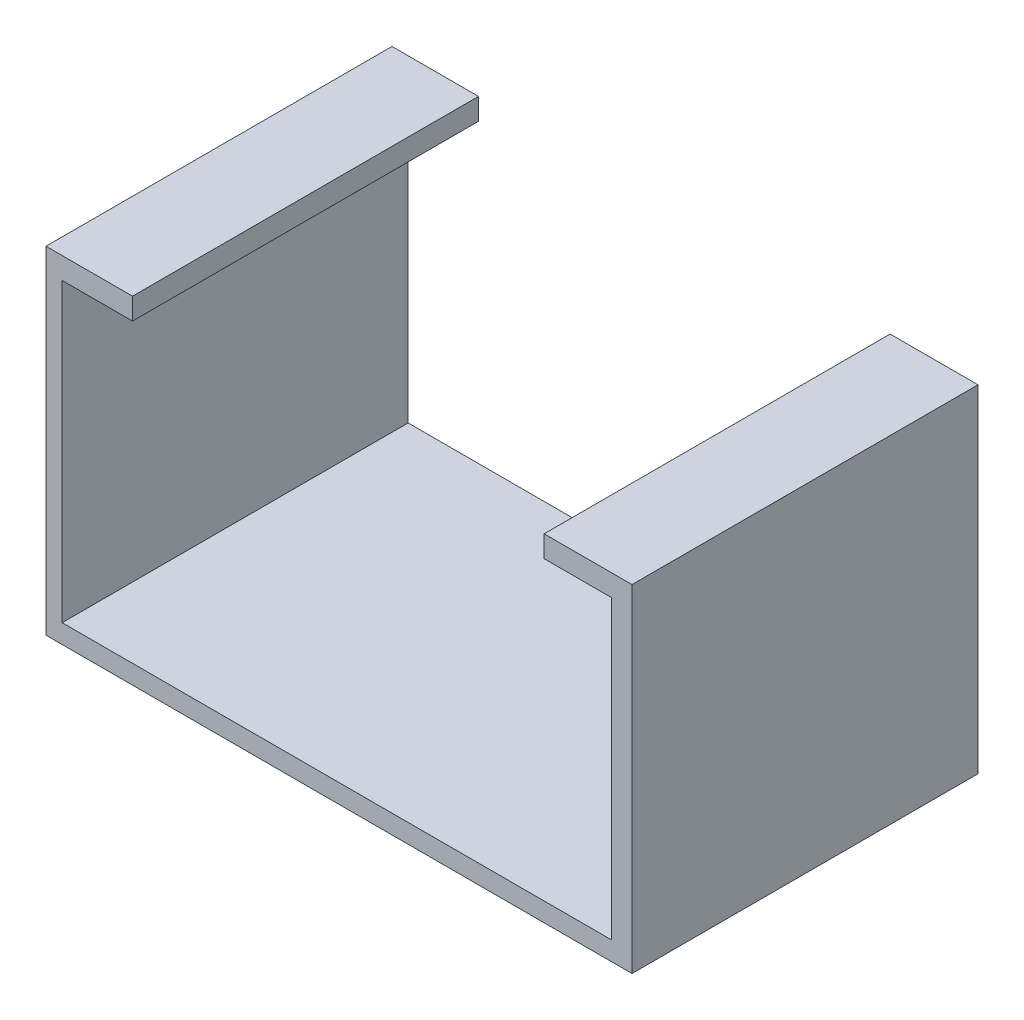
ISO-10303-21;
HEADER;
FILE_DESCRIPTION(('STEP AP214'),'2;1');
FILE_NAME('part.step','',(''),(''),'','','');
FILE_SCHEMA(('AUTOMOTIVE_DESIGN { 1 0 10303 214 1 1 1 1 }'));
ENDSEC;
DATA;
#1=APPLICATION_CONTEXT('core data for automotive mechanical design processes');
#2=APPLICATION_PROTOCOL_DEFINITION('international standard','automotive_design',2000,#1);
#3=PRODUCT_CONTEXT('',#1,'mechanical');
#4=PRODUCT('Part','Part','',(#3));
#5=PRODUCT_RELATED_PRODUCT_CATEGORY('part','',(#4));
#6=PRODUCT_DEFINITION_FORMATION('','',#4);
#7=PRODUCT_DEFINITION_CONTEXT('part definition',#1,'design');
#8=PRODUCT_DEFINITION('design','',#6,#7);
#9=PRODUCT_DEFINITION_SHAPE('','',#8);
#10=(LENGTH_UNIT() NAMED_UNIT(*) SI_UNIT(.MILLI.,.METRE.));
#11=(NAMED_UNIT(*) PLANE_ANGLE_UNIT() SI_UNIT($,.RADIAN.));
#12=(NAMED_UNIT(*) SI_UNIT($,.STERADIAN.) SOLID_ANGLE_UNIT());
#13=UNCERTAINTY_MEASURE_WITH_UNIT(LENGTH_MEASURE(1.E-05),#10,'distance_accuracy_value','');
#14=(GEOMETRIC_REPRESENTATION_CONTEXT(3) GLOBAL_UNCERTAINTY_ASSIGNED_CONTEXT((#13)) GLOBAL_UNIT_ASSIGNED_CONTEXT((#10,
#11,#12)) REPRESENTATION_CONTEXT('',''));
#15=CARTESIAN_POINT('',(0.,0.,0.));
#16=DIRECTION('',(0.,0.,1.));
#17=DIRECTION('',(1.,0.,0.));
#18=AXIS2_PLACEMENT_3D('',#15,#16,#17);
#19=CARTESIAN_POINT('',(-5.08115062,-2.921,6.0000007));
#20=DIRECTION('',(0.,0.,1.));
#21=DIRECTION('',(1.,0.,0.));
#22=AXIS2_PLACEMENT_3D('',#19,#20,#21);
#23=PLANE('',#22);
#24=DIRECTION('',(-1.,0.,0.));
#25=VECTOR('',#24,1.);
#26=CARTESIAN_POINT('',(5.08115062,-2.921,6.0000007));
#27=LINE('',#26,#25);
#28=CARTESIAN_POINT('',(5.08115062,-2.921,6.0000007));
#29=VERTEX_POINT('',#28);
#30=CARTESIAN_POINT('',(-5.08115062,-2.921,6.0000007));
#31=VERTEX_POINT('',#30);
#32=EDGE_CURVE('E27',#29,#31,#27,.T.);
#33=ORIENTED_EDGE('',*,*,#32,.F.);
#34=DIRECTION('',(0.,-1.,0.));
#35=VECTOR('',#34,1.);
#36=CARTESIAN_POINT('',(5.08115062,2.921,6.0000007));
#37=LINE('',#36,#35);
#38=CARTESIAN_POINT('',(5.08115062,2.921,6.0000007));
#39=VERTEX_POINT('',#38);
#40=EDGE_CURVE('E204',#39,#29,#37,.T.);
#41=ORIENTED_EDGE('',*,*,#40,.F.);
#42=DIRECTION('',(1.,0.,0.));
#43=VECTOR('',#42,1.);
#44=CARTESIAN_POINT('',(3.55715062,2.921,6.0000007));
#45=LINE('',#44,#43);
#46=CARTESIAN_POINT('',(3.55715062,2.921,6.0000007));
#47=VERTEX_POINT('',#46);
#48=EDGE_CURVE('E198',#47,#39,#45,.T.);
#49=ORIENTED_EDGE('',*,*,#48,.F.);
#50=DIRECTION('',(0.,1.,0.));
#51=VECTOR('',#50,1.);
#52=CARTESIAN_POINT('',(3.55715062,2.54700024,6.0000007));
#53=LINE('',#52,#51);
#54=CARTESIAN_POINT('',(3.55715062,2.54700024,6.0000007));
#55=VERTEX_POINT('',#54);
#56=EDGE_CURVE('E230',#55,#47,#53,.T.);
#57=ORIENTED_EDGE('',*,*,#56,.F.);
#58=DIRECTION('',(-1.,0.,0.));
#59=VECTOR('',#58,1.);
#60=CARTESIAN_POINT('',(4.72115134,2.54700024,6.0000007));
#61=LINE('',#60,#59);
#62=CARTESIAN_POINT('',(4.72115134,2.54700024,6.0000007));
#63=VERTEX_POINT('',#62);
#64=EDGE_CURVE('E177',#63,#55,#61,.T.);
#65=ORIENTED_EDGE('',*,*,#64,.F.);
#66=DIRECTION('',(0.,1.,0.));
#67=VECTOR('',#66,1.);
#68=CARTESIAN_POINT('',(4.72115134,-2.59299964,6.0000007));
#69=LINE('',#68,#67);
#70=CARTESIAN_POINT('',(4.72115134,-2.59299964,6.0000007));
#71=VERTEX_POINT('',#70);
#72=EDGE_CURVE('E186',#71,#63,#69,.T.);
#73=ORIENTED_EDGE('',*,*,#72,.F.);
#74=DIRECTION('',(1.,0.,0.));
#75=VECTOR('',#74,1.);
#76=CARTESIAN_POINT('',(-4.80115118,-2.59299964,6.0000007));
#77=LINE('',#76,#75);
#78=CARTESIAN_POINT('',(-4.80115118,-2.59299964,6.0000007));
#79=VERTEX_POINT('',#78);
#80=EDGE_CURVE('E170',#79,#71,#77,.T.);
#81=ORIENTED_EDGE('',*,*,#80,.F.);
#82=DIRECTION('',(0.,-1.,0.));
#83=VECTOR('',#82,1.);
#84=CARTESIAN_POINT('',(-4.80115118,2.54700024,6.0000007));
#85=LINE('',#84,#83);
#86=CARTESIAN_POINT('',(-4.80115118,2.54700024,6.0000007));
#87=VERTEX_POINT('',#86);
#88=EDGE_CURVE('E192',#87,#79,#85,.T.);
#89=ORIENTED_EDGE('',*,*,#88,.F.);
#90=DIRECTION('',(-1.,0.,0.));
#91=VECTOR('',#90,1.);
#92=CARTESIAN_POINT('',(-3.58115108,2.54700024,6.0000007));
#93=LINE('',#92,#91);
#94=CARTESIAN_POINT('',(-3.58115108,2.54700024,6.0000007));
#95=VERTEX_POINT('',#94);
#96=EDGE_CURVE('E141',#95,#87,#93,.T.);
#97=ORIENTED_EDGE('',*,*,#96,.F.);
#98=DIRECTION('',(0.,-1.,0.));
#99=VECTOR('',#98,1.);
#100=CARTESIAN_POINT('',(-3.58115108,2.921,6.0000007));
#101=LINE('',#100,#99);
#102=CARTESIAN_POINT('',(-3.58115108,2.921,6.0000007));
#103=VERTEX_POINT('',#102);
#104=EDGE_CURVE('E152',#103,#95,#101,.T.);
#105=ORIENTED_EDGE('',*,*,#104,.F.);
#106=DIRECTION('',(1.,0.,0.));
#107=VECTOR('',#106,1.);
#108=CARTESIAN_POINT('',(-5.08115062,2.921,6.0000007));
#109=LINE('',#108,#107);
#110=CARTESIAN_POINT('',(-5.08115062,2.921,6.0000007));
#111=VERTEX_POINT('',#110);
#112=EDGE_CURVE('E155',#111,#103,#109,.T.);
#113=ORIENTED_EDGE('',*,*,#112,.F.);
#114=DIRECTION('',(0.,1.,0.));
#115=VECTOR('',#114,1.);
#116=CARTESIAN_POINT('',(-5.08115062,-2.921,6.0000007));
#117=LINE('',#116,#115);
#118=EDGE_CURVE('E203',#31,#111,#117,.T.);
#119=ORIENTED_EDGE('',*,*,#118,.F.);
#120=EDGE_LOOP('',(#33,#41,#49,#57,#65,#73,#81,#89,#97,#105,#113,#119));
#121=FACE_BOUND('',#120,.T.);
#122=ADVANCED_FACE('F16',(#121),#23,.T.);
#123=CARTESIAN_POINT('',(-5.08115062,-2.921,0.));
#124=DIRECTION('',(0.,0.,1.));
#125=DIRECTION('',(1.,0.,0.));
#126=AXIS2_PLACEMENT_3D('',#123,#124,#125);
#127=PLANE('',#126);
#128=DIRECTION('',(0.,1.,0.));
#129=VECTOR('',#128,1.);
#130=CARTESIAN_POINT('',(-5.08115062,-2.921,0.));
#131=LINE('',#130,#129);
#132=CARTESIAN_POINT('',(-5.08115062,-2.921,0.));
#133=VERTEX_POINT('',#132);
#134=CARTESIAN_POINT('',(-5.08115062,2.921,0.));
#135=VERTEX_POINT('',#134);
#136=EDGE_CURVE('E147',#133,#135,#131,.T.);
#137=ORIENTED_EDGE('',*,*,#136,.T.);
#138=DIRECTION('',(1.,0.,0.));
#139=VECTOR('',#138,1.);
#140=CARTESIAN_POINT('',(-5.08115062,2.921,0.));
#141=LINE('',#140,#139);
#142=CARTESIAN_POINT('',(-3.58115108,2.921,0.));
#143=VERTEX_POINT('',#142);
#144=EDGE_CURVE('E144',#135,#143,#141,.T.);
#145=ORIENTED_EDGE('',*,*,#144,.T.);
#146=DIRECTION('',(0.,-1.,0.));
#147=VECTOR('',#146,1.);
#148=CARTESIAN_POINT('',(-3.58115108,2.921,0.));
#149=LINE('',#148,#147);
#150=CARTESIAN_POINT('',(-3.58115108,2.54700024,0.));
#151=VERTEX_POINT('',#150);
#152=EDGE_CURVE('E129',#143,#151,#149,.T.);
#153=ORIENTED_EDGE('',*,*,#152,.T.);
#154=DIRECTION('',(-1.,0.,0.));
#155=VECTOR('',#154,1.);
#156=CARTESIAN_POINT('',(-3.58115108,2.54700024,0.));
#157=LINE('',#156,#155);
#158=CARTESIAN_POINT('',(-4.80115118,2.54700024,0.));
#159=VERTEX_POINT('',#158);
#160=EDGE_CURVE('E213',#151,#159,#157,.T.);
#161=ORIENTED_EDGE('',*,*,#160,.T.);
#162=DIRECTION('',(0.,-1.,0.));
#163=VECTOR('',#162,1.);
#164=CARTESIAN_POINT('',(-4.80115118,2.54700024,0.));
#165=LINE('',#164,#163);
#166=CARTESIAN_POINT('',(-4.80115118,-2.59299964,0.));
#167=VERTEX_POINT('',#166);
#168=EDGE_CURVE('E166',#159,#167,#165,.T.);
#169=ORIENTED_EDGE('',*,*,#168,.T.);
#170=DIRECTION('',(1.,0.,0.));
#171=VECTOR('',#170,1.);
#172=CARTESIAN_POINT('',(-4.80115118,-2.59299964,0.));
#173=LINE('',#172,#171);
#174=CARTESIAN_POINT('',(4.72115134,-2.59299964,0.));
#175=VERTEX_POINT('',#174);
#176=EDGE_CURVE('E234',#167,#175,#173,.T.);
#177=ORIENTED_EDGE('',*,*,#176,.T.);
#178=DIRECTION('',(0.,1.,0.));
#179=VECTOR('',#178,1.);
#180=CARTESIAN_POINT('',(4.72115134,-2.59299964,0.));
#181=LINE('',#180,#179);
#182=CARTESIAN_POINT('',(4.72115134,2.54700024,0.));
#183=VERTEX_POINT('',#182);
#184=EDGE_CURVE('E185',#175,#183,#181,.T.);
#185=ORIENTED_EDGE('',*,*,#184,.T.);
#186=DIRECTION('',(-1.,0.,0.));
#187=VECTOR('',#186,1.);
#188=CARTESIAN_POINT('',(4.72115134,2.54700024,0.));
#189=LINE('',#188,#187);
#190=CARTESIAN_POINT('',(3.55715062,2.54700024,0.));
#191=VERTEX_POINT('',#190);
#192=EDGE_CURVE('E176',#183,#191,#189,.T.);
#193=ORIENTED_EDGE('',*,*,#192,.T.);
#194=DIRECTION('',(0.,1.,0.));
#195=VECTOR('',#194,1.);
#196=CARTESIAN_POINT('',(3.55715062,2.54700024,0.));
#197=LINE('',#196,#195);
#198=CARTESIAN_POINT('',(3.55715062,2.921,0.));
#199=VERTEX_POINT('',#198);
#200=EDGE_CURVE('E214',#191,#199,#197,.T.);
#201=ORIENTED_EDGE('',*,*,#200,.T.);
#202=DIRECTION('',(1.,0.,0.));
#203=VECTOR('',#202,1.);
#204=CARTESIAN_POINT('',(3.55715062,2.921,0.));
#205=LINE('',#204,#203);
#206=CARTESIAN_POINT('',(5.08115062,2.921,0.));
#207=VERTEX_POINT('',#206);
#208=EDGE_CURVE('E197',#199,#207,#205,.T.);
#209=ORIENTED_EDGE('',*,*,#208,.T.);
#210=DIRECTION('',(0.,-1.,0.));
#211=VECTOR('',#210,1.);
#212=CARTESIAN_POINT('',(5.08115062,2.921,0.));
#213=LINE('',#212,#211);
#214=CARTESIAN_POINT('',(5.08115062,-2.921,0.));
#215=VERTEX_POINT('',#214);
#216=EDGE_CURVE('E226',#207,#215,#213,.T.);
#217=ORIENTED_EDGE('',*,*,#216,.T.);
#218=DIRECTION('',(-1.,0.,0.));
#219=VECTOR('',#218,1.);
#220=CARTESIAN_POINT('',(5.08115062,-2.921,0.));
#221=LINE('',#220,#219);
#222=EDGE_CURVE('E11',#215,#133,#221,.T.);
#223=ORIENTED_EDGE('',*,*,#222,.T.);
#224=EDGE_LOOP('',(#137,#145,#153,#161,#169,#177,#185,#193,#201,#209,#217,#223));
#225=FACE_BOUND('',#224,.T.);
#226=ADVANCED_FACE('F145',(#225),#127,.F.);
#227=CARTESIAN_POINT('',(5.08115062,-2.921,0.));
#228=DIRECTION('',(0.,-1.,0.));
#229=DIRECTION('',(0.,0.,-1.));
#230=AXIS2_PLACEMENT_3D('',#227,#228,#229);
#231=PLANE('',#230);
#232=DIRECTION('',(0.,0.,1.));
#233=VECTOR('',#232,1.);
#234=CARTESIAN_POINT('',(5.08115062,-2.921,0.));
#235=LINE('',#234,#233);
#236=EDGE_CURVE('E208',#215,#29,#235,.T.);
#237=ORIENTED_EDGE('',*,*,#236,.T.);
#238=ORIENTED_EDGE('',*,*,#32,.T.);
#239=DIRECTION('',(0.,0.,1.));
#240=VECTOR('',#239,1.);
#241=CARTESIAN_POINT('',(-5.08115062,-2.921,0.));
#242=LINE('',#241,#240);
#243=EDGE_CURVE('E199',#133,#31,#242,.T.);
#244=ORIENTED_EDGE('',*,*,#243,.F.);
#245=ORIENTED_EDGE('',*,*,#222,.F.);
#246=EDGE_LOOP('',(#237,#238,#244,#245));
#247=FACE_BOUND('',#246,.T.);
#248=ADVANCED_FACE('F352',(#247),#231,.T.);
#249=CARTESIAN_POINT('',(5.08115062,2.921,0.));
#250=DIRECTION('',(1.,0.,0.));
#251=DIRECTION('',(0.,1.,0.));
#252=AXIS2_PLACEMENT_3D('',#249,#250,#251);
#253=PLANE('',#252);
#254=DIRECTION('',(0.,0.,1.));
#255=VECTOR('',#254,1.);
#256=CARTESIAN_POINT('',(5.08115062,2.921,0.));
#257=LINE('',#256,#255);
#258=EDGE_CURVE('E193',#207,#39,#257,.T.);
#259=ORIENTED_EDGE('',*,*,#258,.T.);
#260=ORIENTED_EDGE('',*,*,#40,.T.);
#261=ORIENTED_EDGE('',*,*,#236,.F.);
#262=ORIENTED_EDGE('',*,*,#216,.F.);
#263=EDGE_LOOP('',(#259,#260,#261,#262));
#264=FACE_BOUND('',#263,.T.);
#265=ADVANCED_FACE('F346',(#264),#253,.T.);
#266=CARTESIAN_POINT('',(3.55715062,2.921,0.));
#267=DIRECTION('',(0.,1.,0.));
#268=DIRECTION('',(1.,0.,0.));
#269=AXIS2_PLACEMENT_3D('',#266,#267,#268);
#270=PLANE('',#269);
#271=DIRECTION('',(0.,0.,1.));
#272=VECTOR('',#271,1.);
#273=CARTESIAN_POINT('',(3.55715062,2.921,0.));
#274=LINE('',#273,#272);
#275=EDGE_CURVE('E218',#199,#47,#274,.T.);
#276=ORIENTED_EDGE('',*,*,#275,.T.);
#277=ORIENTED_EDGE('',*,*,#48,.T.);
#278=ORIENTED_EDGE('',*,*,#258,.F.);
#279=ORIENTED_EDGE('',*,*,#208,.F.);
#280=EDGE_LOOP('',(#276,#277,#278,#279));
#281=FACE_BOUND('',#280,.T.);
#282=ADVANCED_FACE('F351',(#281),#270,.T.);
#283=CARTESIAN_POINT('',(3.55715062,2.54700024,0.));
#284=DIRECTION('',(-1.,0.,0.));
#285=DIRECTION('',(0.,0.,1.));
#286=AXIS2_PLACEMENT_3D('',#283,#284,#285);
#287=PLANE('',#286);
#288=DIRECTION('',(0.,0.,1.));
#289=VECTOR('',#288,1.);
#290=CARTESIAN_POINT('',(3.55715062,2.54700024,0.));
#291=LINE('',#290,#289);
#292=EDGE_CURVE('E172',#191,#55,#291,.T.);
#293=ORIENTED_EDGE('',*,*,#292,.T.);
#294=ORIENTED_EDGE('',*,*,#56,.T.);
#295=ORIENTED_EDGE('',*,*,#275,.F.);
#296=ORIENTED_EDGE('',*,*,#200,.F.);
#297=EDGE_LOOP('',(#293,#294,#295,#296));
#298=FACE_BOUND('',#297,.T.);
#299=ADVANCED_FACE('F388',(#298),#287,.T.);
#300=CARTESIAN_POINT('',(4.72115134,2.54700024,0.));
#301=DIRECTION('',(0.,-1.,0.));
#302=DIRECTION('',(0.,0.,-1.));
#303=AXIS2_PLACEMENT_3D('',#300,#301,#302);
#304=PLANE('',#303);
#305=DIRECTION('',(0.,0.,1.));
#306=VECTOR('',#305,1.);
#307=CARTESIAN_POINT('',(4.72115134,2.54700024,0.));
#308=LINE('',#307,#306);
#309=EDGE_CURVE('E181',#183,#63,#308,.T.);
#310=ORIENTED_EDGE('',*,*,#309,.T.);
#311=ORIENTED_EDGE('',*,*,#64,.T.);
#312=ORIENTED_EDGE('',*,*,#292,.F.);
#313=ORIENTED_EDGE('',*,*,#192,.F.);
#314=EDGE_LOOP('',(#310,#311,#312,#313));
#315=FACE_BOUND('',#314,.T.);
#316=ADVANCED_FACE('F382',(#315),#304,.T.);
#317=CARTESIAN_POINT('',(4.72115134,-2.59299964,0.));
#318=DIRECTION('',(-1.,0.,0.));
#319=DIRECTION('',(0.,0.,1.));
#320=AXIS2_PLACEMENT_3D('',#317,#318,#319);
#321=PLANE('',#320);
#322=DIRECTION('',(0.,0.,1.));
#323=VECTOR('',#322,1.);
#324=CARTESIAN_POINT('',(4.72115134,-2.59299964,0.));
#325=LINE('',#324,#323);
#326=EDGE_CURVE('E20',#175,#71,#325,.T.);
#327=ORIENTED_EDGE('',*,*,#326,.T.);
#328=ORIENTED_EDGE('',*,*,#72,.T.);
#329=ORIENTED_EDGE('',*,*,#309,.F.);
#330=ORIENTED_EDGE('',*,*,#184,.F.);
#331=EDGE_LOOP('',(#327,#328,#329,#330));
#332=FACE_BOUND('',#331,.T.);
#333=ADVANCED_FACE('F387',(#332),#321,.T.);
#334=CARTESIAN_POINT('',(-4.80115118,-2.59299964,0.));
#335=DIRECTION('',(0.,1.,0.));
#336=DIRECTION('',(1.,0.,0.));
#337=AXIS2_PLACEMENT_3D('',#334,#335,#336);
#338=PLANE('',#337);
#339=DIRECTION('',(0.,0.,1.));
#340=VECTOR('',#339,1.);
#341=CARTESIAN_POINT('',(-4.80115118,-2.59299964,0.));
#342=LINE('',#341,#340);
#343=EDGE_CURVE('E171',#167,#79,#342,.T.);
#344=ORIENTED_EDGE('',*,*,#343,.T.);
#345=ORIENTED_EDGE('',*,*,#80,.T.);
#346=ORIENTED_EDGE('',*,*,#326,.F.);
#347=ORIENTED_EDGE('',*,*,#176,.F.);
#348=EDGE_LOOP('',(#344,#345,#346,#347));
#349=FACE_BOUND('',#348,.T.);
#350=ADVANCED_FACE('F18',(#349),#338,.T.);
#351=CARTESIAN_POINT('',(-4.80115118,2.54700024,0.));
#352=DIRECTION('',(1.,0.,0.));
#353=DIRECTION('',(0.,1.,0.));
#354=AXIS2_PLACEMENT_3D('',#351,#352,#353);
#355=PLANE('',#354);
#356=DIRECTION('',(0.,0.,1.));
#357=VECTOR('',#356,1.);
#358=CARTESIAN_POINT('',(-4.80115118,2.54700024,0.));
#359=LINE('',#358,#357);
#360=EDGE_CURVE('E209',#159,#87,#359,.T.);
#361=ORIENTED_EDGE('',*,*,#360,.T.);
#362=ORIENTED_EDGE('',*,*,#88,.T.);
#363=ORIENTED_EDGE('',*,*,#343,.F.);
#364=ORIENTED_EDGE('',*,*,#168,.F.);
#365=EDGE_LOOP('',(#361,#362,#363,#364));
#366=FACE_BOUND('',#365,.T.);
#367=ADVANCED_FACE('F269',(#366),#355,.T.);
#368=CARTESIAN_POINT('',(-3.58115108,2.54700024,0.));
#369=DIRECTION('',(0.,-1.,0.));
#370=DIRECTION('',(0.,0.,-1.));
#371=AXIS2_PLACEMENT_3D('',#368,#369,#370);
#372=PLANE('',#371);
#373=DIRECTION('',(0.,0.,1.));
#374=VECTOR('',#373,1.);
#375=CARTESIAN_POINT('',(-3.58115108,2.54700024,0.));
#376=LINE('',#375,#374);
#377=EDGE_CURVE('E137',#151,#95,#376,.T.);
#378=ORIENTED_EDGE('',*,*,#377,.T.);
#379=ORIENTED_EDGE('',*,*,#96,.T.);
#380=ORIENTED_EDGE('',*,*,#360,.F.);
#381=ORIENTED_EDGE('',*,*,#160,.F.);
#382=EDGE_LOOP('',(#378,#379,#380,#381));
#383=FACE_BOUND('',#382,.T.);
#384=ADVANCED_FACE('F264',(#383),#372,.T.);
#385=CARTESIAN_POINT('',(-3.58115108,2.921,0.));
#386=DIRECTION('',(1.,0.,0.));
#387=DIRECTION('',(0.,1.,0.));
#388=AXIS2_PLACEMENT_3D('',#385,#386,#387);
#389=PLANE('',#388);
#390=DIRECTION('',(0.,0.,1.));
#391=VECTOR('',#390,1.);
#392=CARTESIAN_POINT('',(-3.58115108,2.921,0.));
#393=LINE('',#392,#391);
#394=EDGE_CURVE('E134',#143,#103,#393,.T.);
#395=ORIENTED_EDGE('',*,*,#394,.T.);
#396=ORIENTED_EDGE('',*,*,#104,.T.);
#397=ORIENTED_EDGE('',*,*,#377,.F.);
#398=ORIENTED_EDGE('',*,*,#152,.F.);
#399=EDGE_LOOP('',(#395,#396,#397,#398));
#400=FACE_BOUND('',#399,.T.);
#401=ADVANCED_FACE('F131',(#400),#389,.T.);
#402=CARTESIAN_POINT('',(-5.08115062,2.921,0.));
#403=DIRECTION('',(0.,1.,0.));
#404=DIRECTION('',(1.,0.,0.));
#405=AXIS2_PLACEMENT_3D('',#402,#403,#404);
#406=PLANE('',#405);
#407=DIRECTION('',(0.,0.,1.));
#408=VECTOR('',#407,1.);
#409=CARTESIAN_POINT('',(-5.08115062,2.921,0.));
#410=LINE('',#409,#408);
#411=EDGE_CURVE('E180',#135,#111,#410,.T.);
#412=ORIENTED_EDGE('',*,*,#411,.T.);
#413=ORIENTED_EDGE('',*,*,#112,.T.);
#414=ORIENTED_EDGE('',*,*,#394,.F.);
#415=ORIENTED_EDGE('',*,*,#144,.F.);
#416=EDGE_LOOP('',(#412,#413,#414,#415));
#417=FACE_BOUND('',#416,.T.);
#418=ADVANCED_FACE('F154',(#417),#406,.T.);
#419=CARTESIAN_POINT('',(-5.08115062,-2.921,0.));
#420=DIRECTION('',(-1.,0.,0.));
#421=DIRECTION('',(0.,0.,1.));
#422=AXIS2_PLACEMENT_3D('',#419,#420,#421);
#423=PLANE('',#422);
#424=ORIENTED_EDGE('',*,*,#243,.T.);
#425=ORIENTED_EDGE('',*,*,#118,.T.);
#426=ORIENTED_EDGE('',*,*,#411,.F.);
#427=ORIENTED_EDGE('',*,*,#136,.F.);
#428=EDGE_LOOP('',(#424,#425,#426,#427));
#429=FACE_BOUND('',#428,.T.);
#430=ADVANCED_FACE('F439',(#429),#423,.T.);
#431=CLOSED_SHELL('',(#122,#226,#248,#265,#282,#299,#316,#333,#350,#367,#384,#401,#418,#430));
#432=MANIFOLD_SOLID_BREP('B1',#431);
#433=ADVANCED_BREP_SHAPE_REPRESENTATION('',(#18,#432),#14);
#434=SHAPE_DEFINITION_REPRESENTATION(#9,#433);
ENDSEC;
END-ISO-10303-21;
